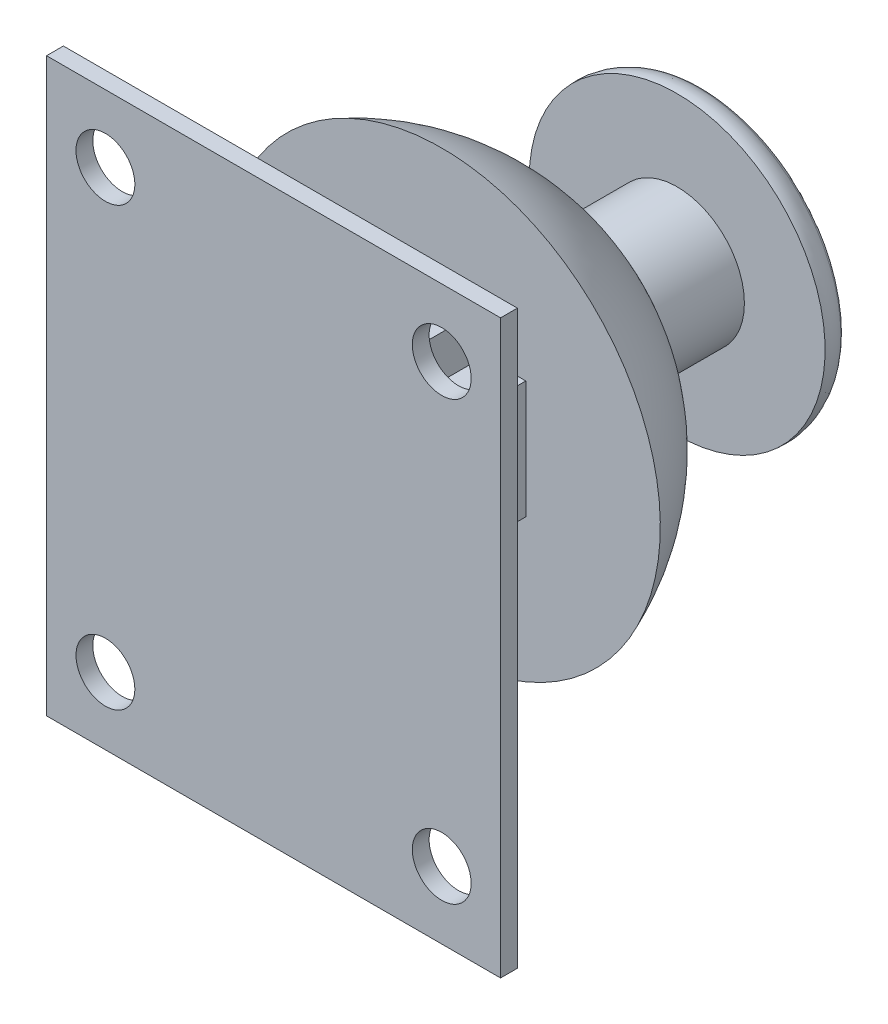
ISO-10303-21;
HEADER;
FILE_DESCRIPTION(('STEP AP214'),'2;1');
FILE_NAME('part.step','',(''),(''),'','','');
FILE_SCHEMA(('AUTOMOTIVE_DESIGN { 1 0 10303 214 1 1 1 1 }'));
ENDSEC;
DATA;
#1=APPLICATION_CONTEXT('core data for automotive mechanical design processes');
#2=APPLICATION_PROTOCOL_DEFINITION('international standard','automotive_design',2000,#1);
#3=PRODUCT_CONTEXT('',#1,'mechanical');
#4=PRODUCT('Part','Part','',(#3));
#5=PRODUCT_RELATED_PRODUCT_CATEGORY('part','',(#4));
#6=PRODUCT_DEFINITION_FORMATION('','',#4);
#7=PRODUCT_DEFINITION_CONTEXT('part definition',#1,'design');
#8=PRODUCT_DEFINITION('design','',#6,#7);
#9=PRODUCT_DEFINITION_SHAPE('','',#8);
#10=(LENGTH_UNIT() NAMED_UNIT(*) SI_UNIT(.MILLI.,.METRE.));
#11=(NAMED_UNIT(*) PLANE_ANGLE_UNIT() SI_UNIT($,.RADIAN.));
#12=(NAMED_UNIT(*) SI_UNIT($,.STERADIAN.) SOLID_ANGLE_UNIT());
#13=UNCERTAINTY_MEASURE_WITH_UNIT(LENGTH_MEASURE(1.E-05),#10,'distance_accuracy_value','');
#14=(GEOMETRIC_REPRESENTATION_CONTEXT(3) GLOBAL_UNCERTAINTY_ASSIGNED_CONTEXT((#13)) GLOBAL_UNIT_ASSIGNED_CONTEXT((#10,
#11,#12)) REPRESENTATION_CONTEXT('',''));
#15=CARTESIAN_POINT('',(0.,0.,0.));
#16=DIRECTION('',(0.,0.,1.));
#17=DIRECTION('',(1.,0.,0.));
#18=AXIS2_PLACEMENT_3D('',#15,#16,#17);
#19=CARTESIAN_POINT('',(0.,0.,1.));
#20=DIRECTION('',(0.,0.,1.));
#21=DIRECTION('',(1.,0.,0.));
#22=AXIS2_PLACEMENT_3D('',#19,#20,#21);
#23=PLANE('',#22);
#24=CARTESIAN_POINT('',(10.,-13.,1.));
#25=DIRECTION('',(0.,0.,1.));
#26=DIRECTION('',(-1.,0.,0.));
#27=AXIS2_PLACEMENT_3D('',#24,#25,#26);
#28=CIRCLE('',#27,1.75);
#29=CARTESIAN_POINT('',(8.25,-13.,1.));
#30=VERTEX_POINT('',#29);
#31=EDGE_CURVE('E361',#30,#30,#28,.T.);
#32=ORIENTED_EDGE('',*,*,#31,.F.);
#33=EDGE_LOOP('',(#32));
#34=FACE_BOUND('',#33,.T.);
#35=CARTESIAN_POINT('',(10.,13.,1.));
#36=DIRECTION('',(0.,0.,1.));
#37=DIRECTION('',(1.,0.,0.));
#38=AXIS2_PLACEMENT_3D('',#35,#36,#37);
#39=CIRCLE('',#38,1.75);
#40=CARTESIAN_POINT('',(11.75,13.,1.));
#41=VERTEX_POINT('',#40);
#42=EDGE_CURVE('E216',#41,#41,#39,.T.);
#43=ORIENTED_EDGE('',*,*,#42,.F.);
#44=EDGE_LOOP('',(#43));
#45=FACE_BOUND('',#44,.T.);
#46=DIRECTION('',(0.,1.,0.));
#47=VECTOR('',#46,1.);
#48=CARTESIAN_POINT('',(13.5,17.,1.));
#49=LINE('',#48,#47);
#50=CARTESIAN_POINT('',(13.5,-17.,1.));
#51=VERTEX_POINT('',#50);
#52=CARTESIAN_POINT('',(13.5,17.,1.));
#53=VERTEX_POINT('',#52);
#54=EDGE_CURVE('E228',#51,#53,#49,.T.);
#55=ORIENTED_EDGE('',*,*,#54,.T.);
#56=DIRECTION('',(-1.,0.,0.));
#57=VECTOR('',#56,1.);
#58=CARTESIAN_POINT('',(-13.5,17.,1.));
#59=LINE('',#58,#57);
#60=CARTESIAN_POINT('',(-13.5,17.,1.));
#61=VERTEX_POINT('',#60);
#62=EDGE_CURVE('E90',#53,#61,#59,.T.);
#63=ORIENTED_EDGE('',*,*,#62,.T.);
#64=DIRECTION('',(0.,-1.,0.));
#65=VECTOR('',#64,1.);
#66=CARTESIAN_POINT('',(-13.5,17.,1.));
#67=LINE('',#66,#65);
#68=CARTESIAN_POINT('',(-13.5,-17.,1.));
#69=VERTEX_POINT('',#68);
#70=EDGE_CURVE('E375',#61,#69,#67,.T.);
#71=ORIENTED_EDGE('',*,*,#70,.T.);
#72=DIRECTION('',(1.,0.,0.));
#73=VECTOR('',#72,1.);
#74=CARTESIAN_POINT('',(-13.5,-17.,1.));
#75=LINE('',#74,#73);
#76=EDGE_CURVE('E61',#69,#51,#75,.T.);
#77=ORIENTED_EDGE('',*,*,#76,.T.);
#78=EDGE_LOOP('',(#55,#63,#71,#77));
#79=FACE_BOUND('',#78,.T.);
#80=CARTESIAN_POINT('',(-10.,13.,1.));
#81=DIRECTION('',(0.,0.,1.));
#82=DIRECTION('',(-1.,0.,0.));
#83=AXIS2_PLACEMENT_3D('',#80,#81,#82);
#84=CIRCLE('',#83,1.75);
#85=CARTESIAN_POINT('',(-11.75,13.,1.));
#86=VERTEX_POINT('',#85);
#87=EDGE_CURVE('E367',#86,#86,#84,.T.);
#88=ORIENTED_EDGE('',*,*,#87,.F.);
#89=EDGE_LOOP('',(#88));
#90=FACE_BOUND('',#89,.T.);
#91=CARTESIAN_POINT('',(-10.,-13.,1.));
#92=DIRECTION('',(0.,0.,1.));
#93=DIRECTION('',(1.,0.,0.));
#94=AXIS2_PLACEMENT_3D('',#91,#92,#93);
#95=CIRCLE('',#94,1.75);
#96=CARTESIAN_POINT('',(-8.25,-13.,1.));
#97=VERTEX_POINT('',#96);
#98=EDGE_CURVE('E355',#97,#97,#95,.T.);
#99=ORIENTED_EDGE('',*,*,#98,.F.);
#100=EDGE_LOOP('',(#99));
#101=FACE_BOUND('',#100,.T.);
#102=ADVANCED_FACE('F37',(#34,#45,#79,#90,#101),#23,.T.);
#103=CARTESIAN_POINT('',(0.,0.,0.));
#104=DIRECTION('',(0.,0.,1.));
#105=DIRECTION('',(1.,0.,0.));
#106=AXIS2_PLACEMENT_3D('',#103,#104,#105);
#107=PLANE('',#106);
#108=DIRECTION('',(0.,1.,0.));
#109=VECTOR('',#108,1.);
#110=CARTESIAN_POINT('',(1.5,0.,0.));
#111=LINE('',#110,#109);
#112=CARTESIAN_POINT('',(1.5,-6.,0.));
#113=VERTEX_POINT('',#112);
#114=CARTESIAN_POINT('',(1.5,-3.5,0.));
#115=VERTEX_POINT('',#114);
#116=EDGE_CURVE('E299',#113,#115,#111,.T.);
#117=ORIENTED_EDGE('',*,*,#116,.T.);
#118=DIRECTION('',(1.,0.,0.));
#119=VECTOR('',#118,1.);
#120=CARTESIAN_POINT('',(0.,-3.5,0.));
#121=LINE('',#120,#119);
#122=CARTESIAN_POINT('',(4.,-3.5,0.));
#123=VERTEX_POINT('',#122);
#124=EDGE_CURVE('E52',#115,#123,#121,.T.);
#125=ORIENTED_EDGE('',*,*,#124,.T.);
#126=DIRECTION('',(0.,-1.,0.));
#127=VECTOR('',#126,1.);
#128=CARTESIAN_POINT('',(4.,0.,0.));
#129=LINE('',#128,#127);
#130=CARTESIAN_POINT('',(4.,3.5,0.));
#131=VERTEX_POINT('',#130);
#132=EDGE_CURVE('E264',#131,#123,#129,.T.);
#133=ORIENTED_EDGE('',*,*,#132,.F.);
#134=DIRECTION('',(1.,0.,0.));
#135=VECTOR('',#134,1.);
#136=CARTESIAN_POINT('',(0.,3.5,0.));
#137=LINE('',#136,#135);
#138=CARTESIAN_POINT('',(1.5,3.5,0.));
#139=VERTEX_POINT('',#138);
#140=EDGE_CURVE('E323',#139,#131,#137,.T.);
#141=ORIENTED_EDGE('',*,*,#140,.F.);
#142=DIRECTION('',(0.,-1.,0.));
#143=VECTOR('',#142,1.);
#144=CARTESIAN_POINT('',(1.5,0.,0.));
#145=LINE('',#144,#143);
#146=CARTESIAN_POINT('',(1.5,6.,0.));
#147=VERTEX_POINT('',#146);
#148=EDGE_CURVE('E321',#147,#139,#145,.T.);
#149=ORIENTED_EDGE('',*,*,#148,.F.);
#150=DIRECTION('',(1.,0.,0.));
#151=VECTOR('',#150,1.);
#152=CARTESIAN_POINT('',(0.,6.,0.));
#153=LINE('',#152,#151);
#154=CARTESIAN_POINT('',(-9.5,6.,0.));
#155=VERTEX_POINT('',#154);
#156=EDGE_CURVE('E319',#155,#147,#153,.T.);
#157=ORIENTED_EDGE('',*,*,#156,.F.);
#158=DIRECTION('',(0.,-1.,0.));
#159=VECTOR('',#158,1.);
#160=CARTESIAN_POINT('',(-9.5,0.,0.));
#161=LINE('',#160,#159);
#162=CARTESIAN_POINT('',(-9.5,3.5,0.));
#163=VERTEX_POINT('',#162);
#164=EDGE_CURVE('E316',#155,#163,#161,.T.);
#165=ORIENTED_EDGE('',*,*,#164,.T.);
#166=DIRECTION('',(-1.,0.,0.));
#167=VECTOR('',#166,1.);
#168=CARTESIAN_POINT('',(0.,3.5,0.));
#169=LINE('',#168,#167);
#170=CARTESIAN_POINT('',(-12.,3.5,0.));
#171=VERTEX_POINT('',#170);
#172=EDGE_CURVE('E313',#163,#171,#169,.T.);
#173=ORIENTED_EDGE('',*,*,#172,.T.);
#174=DIRECTION('',(0.,-1.,0.));
#175=VECTOR('',#174,1.);
#176=CARTESIAN_POINT('',(-12.,0.,0.));
#177=LINE('',#176,#175);
#178=CARTESIAN_POINT('',(-12.,-3.5,0.));
#179=VERTEX_POINT('',#178);
#180=EDGE_CURVE('E310',#171,#179,#177,.T.);
#181=ORIENTED_EDGE('',*,*,#180,.T.);
#182=DIRECTION('',(-1.,0.,0.));
#183=VECTOR('',#182,1.);
#184=CARTESIAN_POINT('',(0.,-3.5,0.));
#185=LINE('',#184,#183);
#186=CARTESIAN_POINT('',(-9.5,-3.5,0.));
#187=VERTEX_POINT('',#186);
#188=EDGE_CURVE('E307',#187,#179,#185,.T.);
#189=ORIENTED_EDGE('',*,*,#188,.F.);
#190=DIRECTION('',(0.,1.,0.));
#191=VECTOR('',#190,1.);
#192=CARTESIAN_POINT('',(-9.5,0.,0.));
#193=LINE('',#192,#191);
#194=CARTESIAN_POINT('',(-9.5,-6.,0.));
#195=VERTEX_POINT('',#194);
#196=EDGE_CURVE('E305',#195,#187,#193,.T.);
#197=ORIENTED_EDGE('',*,*,#196,.F.);
#198=DIRECTION('',(1.,0.,0.));
#199=VECTOR('',#198,1.);
#200=CARTESIAN_POINT('',(0.,-6.,0.));
#201=LINE('',#200,#199);
#202=EDGE_CURVE('E302',#195,#113,#201,.T.);
#203=ORIENTED_EDGE('',*,*,#202,.T.);
#204=EDGE_LOOP('',(#117,#125,#133,#141,#149,#157,#165,#173,#181,#189,#197,#203));
#205=FACE_BOUND('',#204,.T.);
#206=DIRECTION('',(0.,1.,0.));
#207=VECTOR('',#206,1.);
#208=CARTESIAN_POINT('',(13.5,17.,0.));
#209=LINE('',#208,#207);
#210=CARTESIAN_POINT('',(13.5,-17.,0.));
#211=VERTEX_POINT('',#210);
#212=CARTESIAN_POINT('',(13.5,17.,0.));
#213=VERTEX_POINT('',#212);
#214=EDGE_CURVE('E210',#211,#213,#209,.T.);
#215=ORIENTED_EDGE('',*,*,#214,.F.);
#216=DIRECTION('',(1.,0.,0.));
#217=VECTOR('',#216,1.);
#218=CARTESIAN_POINT('',(-13.5,-17.,0.));
#219=LINE('',#218,#217);
#220=CARTESIAN_POINT('',(-13.5,-17.,0.));
#221=VERTEX_POINT('',#220);
#222=EDGE_CURVE('E82',#221,#211,#219,.T.);
#223=ORIENTED_EDGE('',*,*,#222,.F.);
#224=DIRECTION('',(0.,-1.,0.));
#225=VECTOR('',#224,1.);
#226=CARTESIAN_POINT('',(-13.5,17.,0.));
#227=LINE('',#226,#225);
#228=CARTESIAN_POINT('',(-13.5,17.,0.));
#229=VERTEX_POINT('',#228);
#230=EDGE_CURVE('E218',#229,#221,#227,.T.);
#231=ORIENTED_EDGE('',*,*,#230,.F.);
#232=DIRECTION('',(-1.,0.,0.));
#233=VECTOR('',#232,1.);
#234=CARTESIAN_POINT('',(-13.5,17.,0.));
#235=LINE('',#234,#233);
#236=EDGE_CURVE('E215',#213,#229,#235,.T.);
#237=ORIENTED_EDGE('',*,*,#236,.F.);
#238=EDGE_LOOP('',(#215,#223,#231,#237));
#239=FACE_BOUND('',#238,.T.);
#240=CARTESIAN_POINT('',(10.,13.,0.));
#241=DIRECTION('',(0.,0.,1.));
#242=DIRECTION('',(1.,0.,0.));
#243=AXIS2_PLACEMENT_3D('',#240,#241,#242);
#244=CIRCLE('',#243,1.75);
#245=CARTESIAN_POINT('',(11.75,13.,0.));
#246=VERTEX_POINT('',#245);
#247=EDGE_CURVE('E221',#246,#246,#244,.T.);
#248=ORIENTED_EDGE('',*,*,#247,.T.);
#249=EDGE_LOOP('',(#248));
#250=FACE_BOUND('',#249,.T.);
#251=CARTESIAN_POINT('',(-10.,13.,0.));
#252=DIRECTION('',(0.,0.,1.));
#253=DIRECTION('',(-1.,0.,0.));
#254=AXIS2_PLACEMENT_3D('',#251,#252,#253);
#255=CIRCLE('',#254,1.75);
#256=CARTESIAN_POINT('',(-11.75,13.,0.));
#257=VERTEX_POINT('',#256);
#258=EDGE_CURVE('E364',#257,#257,#255,.T.);
#259=ORIENTED_EDGE('',*,*,#258,.T.);
#260=EDGE_LOOP('',(#259));
#261=FACE_BOUND('',#260,.T.);
#262=CARTESIAN_POINT('',(10.,-13.,0.));
#263=DIRECTION('',(0.,0.,1.));
#264=DIRECTION('',(-1.,0.,0.));
#265=AXIS2_PLACEMENT_3D('',#262,#263,#264);
#266=CIRCLE('',#265,1.75);
#267=CARTESIAN_POINT('',(8.25,-13.,0.));
#268=VERTEX_POINT('',#267);
#269=EDGE_CURVE('E358',#268,#268,#266,.T.);
#270=ORIENTED_EDGE('',*,*,#269,.T.);
#271=EDGE_LOOP('',(#270));
#272=FACE_BOUND('',#271,.T.);
#273=CARTESIAN_POINT('',(-10.,-13.,0.));
#274=DIRECTION('',(0.,0.,1.));
#275=DIRECTION('',(1.,0.,0.));
#276=AXIS2_PLACEMENT_3D('',#273,#274,#275);
#277=CIRCLE('',#276,1.75);
#278=CARTESIAN_POINT('',(-8.25,-13.,0.));
#279=VERTEX_POINT('',#278);
#280=EDGE_CURVE('E354',#279,#279,#277,.T.);
#281=ORIENTED_EDGE('',*,*,#280,.T.);
#282=EDGE_LOOP('',(#281));
#283=FACE_BOUND('',#282,.T.);
#284=ADVANCED_FACE('F179',(#205,#239,#250,#261,#272,#283),#107,.F.);
#285=CARTESIAN_POINT('',(13.5,17.,1.));
#286=DIRECTION('',(-1.,0.,0.));
#287=DIRECTION('',(0.,0.,1.));
#288=AXIS2_PLACEMENT_3D('',#285,#286,#287);
#289=PLANE('',#288);
#290=ORIENTED_EDGE('',*,*,#214,.T.);
#291=DIRECTION('',(0.,0.,-1.));
#292=VECTOR('',#291,1.);
#293=CARTESIAN_POINT('',(13.5,17.,1.));
#294=LINE('',#293,#292);
#295=EDGE_CURVE('E212',#53,#213,#294,.T.);
#296=ORIENTED_EDGE('',*,*,#295,.F.);
#297=ORIENTED_EDGE('',*,*,#54,.F.);
#298=DIRECTION('',(0.,0.,-1.));
#299=VECTOR('',#298,1.);
#300=CARTESIAN_POINT('',(13.5,-17.,1.));
#301=LINE('',#300,#299);
#302=EDGE_CURVE('E213',#51,#211,#301,.T.);
#303=ORIENTED_EDGE('',*,*,#302,.T.);
#304=EDGE_LOOP('',(#290,#296,#297,#303));
#305=FACE_BOUND('',#304,.T.);
#306=ADVANCED_FACE('F185',(#305),#289,.F.);
#307=CARTESIAN_POINT('',(-13.5,17.,1.));
#308=DIRECTION('',(0.,-1.,0.));
#309=DIRECTION('',(0.,0.,-1.));
#310=AXIS2_PLACEMENT_3D('',#307,#308,#309);
#311=PLANE('',#310);
#312=ORIENTED_EDGE('',*,*,#236,.T.);
#313=DIRECTION('',(0.,0.,-1.));
#314=VECTOR('',#313,1.);
#315=CARTESIAN_POINT('',(-13.5,17.,1.));
#316=LINE('',#315,#314);
#317=EDGE_CURVE('E232',#61,#229,#316,.T.);
#318=ORIENTED_EDGE('',*,*,#317,.F.);
#319=ORIENTED_EDGE('',*,*,#62,.F.);
#320=ORIENTED_EDGE('',*,*,#295,.T.);
#321=EDGE_LOOP('',(#312,#318,#319,#320));
#322=FACE_BOUND('',#321,.T.);
#323=ADVANCED_FACE('F200',(#322),#311,.F.);
#324=CARTESIAN_POINT('',(-13.5,17.,1.));
#325=DIRECTION('',(1.,0.,0.));
#326=DIRECTION('',(0.,0.,-1.));
#327=AXIS2_PLACEMENT_3D('',#324,#325,#326);
#328=PLANE('',#327);
#329=ORIENTED_EDGE('',*,*,#230,.T.);
#330=DIRECTION('',(0.,0.,-1.));
#331=VECTOR('',#330,1.);
#332=CARTESIAN_POINT('',(-13.5,-17.,1.));
#333=LINE('',#332,#331);
#334=EDGE_CURVE('E230',#69,#221,#333,.T.);
#335=ORIENTED_EDGE('',*,*,#334,.F.);
#336=ORIENTED_EDGE('',*,*,#70,.F.);
#337=ORIENTED_EDGE('',*,*,#317,.T.);
#338=EDGE_LOOP('',(#329,#335,#336,#337));
#339=FACE_BOUND('',#338,.T.);
#340=ADVANCED_FACE('F197',(#339),#328,.F.);
#341=CARTESIAN_POINT('',(-13.5,-17.,1.));
#342=DIRECTION('',(0.,1.,0.));
#343=DIRECTION('',(0.,0.,1.));
#344=AXIS2_PLACEMENT_3D('',#341,#342,#343);
#345=PLANE('',#344);
#346=ORIENTED_EDGE('',*,*,#222,.T.);
#347=ORIENTED_EDGE('',*,*,#302,.F.);
#348=ORIENTED_EDGE('',*,*,#76,.F.);
#349=ORIENTED_EDGE('',*,*,#334,.T.);
#350=EDGE_LOOP('',(#346,#347,#348,#349));
#351=FACE_BOUND('',#350,.T.);
#352=ADVANCED_FACE('F194',(#351),#345,.F.);
#353=CARTESIAN_POINT('',(10.,13.,1.));
#354=DIRECTION('',(0.,0.,-1.));
#355=DIRECTION('',(-1.,0.,0.));
#356=AXIS2_PLACEMENT_3D('',#353,#354,#355);
#357=CYLINDRICAL_SURFACE('',#356,1.75);
#358=ORIENTED_EDGE('',*,*,#42,.T.);
#359=EDGE_LOOP('',(#358));
#360=FACE_BOUND('',#359,.T.);
#361=ORIENTED_EDGE('',*,*,#247,.F.);
#362=EDGE_LOOP('',(#361));
#363=FACE_BOUND('',#362,.T.);
#364=ADVANCED_FACE('F191',(#360,#363),#357,.F.);
#365=CARTESIAN_POINT('',(-10.,13.,1.));
#366=DIRECTION('',(0.,0.,-1.));
#367=DIRECTION('',(-1.,0.,0.));
#368=AXIS2_PLACEMENT_3D('',#365,#366,#367);
#369=CYLINDRICAL_SURFACE('',#368,1.75);
#370=ORIENTED_EDGE('',*,*,#87,.T.);
#371=EDGE_LOOP('',(#370));
#372=FACE_BOUND('',#371,.T.);
#373=ORIENTED_EDGE('',*,*,#258,.F.);
#374=EDGE_LOOP('',(#373));
#375=FACE_BOUND('',#374,.T.);
#376=ADVANCED_FACE('F401',(#372,#375),#369,.F.);
#377=CARTESIAN_POINT('',(10.,-13.,1.));
#378=DIRECTION('',(0.,0.,-1.));
#379=DIRECTION('',(-1.,0.,0.));
#380=AXIS2_PLACEMENT_3D('',#377,#378,#379);
#381=CYLINDRICAL_SURFACE('',#380,1.75);
#382=ORIENTED_EDGE('',*,*,#31,.T.);
#383=EDGE_LOOP('',(#382));
#384=FACE_BOUND('',#383,.T.);
#385=ORIENTED_EDGE('',*,*,#269,.F.);
#386=EDGE_LOOP('',(#385));
#387=FACE_BOUND('',#386,.T.);
#388=ADVANCED_FACE('F392',(#384,#387),#381,.F.);
#389=CARTESIAN_POINT('',(-10.,-13.,1.));
#390=DIRECTION('',(0.,0.,-1.));
#391=DIRECTION('',(-1.,0.,0.));
#392=AXIS2_PLACEMENT_3D('',#389,#390,#391);
#393=CYLINDRICAL_SURFACE('',#392,1.75);
#394=ORIENTED_EDGE('',*,*,#98,.T.);
#395=EDGE_LOOP('',(#394));
#396=FACE_BOUND('',#395,.T.);
#397=ORIENTED_EDGE('',*,*,#280,.F.);
#398=EDGE_LOOP('',(#397));
#399=FACE_BOUND('',#398,.T.);
#400=ADVANCED_FACE('F389',(#396,#399),#393,.F.);
#401=CARTESIAN_POINT('',(0.,-3.5,-10.));
#402=DIRECTION('',(0.,-1.,0.));
#403=DIRECTION('',(0.,0.,-1.));
#404=AXIS2_PLACEMENT_3D('',#401,#402,#403);
#405=PLANE('',#404);
#406=ORIENTED_EDGE('',*,*,#124,.F.);
#407=DIRECTION('',(0.,0.,1.));
#408=VECTOR('',#407,1.);
#409=CARTESIAN_POINT('',(1.5,-3.5,-10.));
#410=LINE('',#409,#408);
#411=CARTESIAN_POINT('',(1.5,-3.5,-10.));
#412=VERTEX_POINT('',#411);
#413=EDGE_CURVE('E352',#412,#115,#410,.T.);
#414=ORIENTED_EDGE('',*,*,#413,.F.);
#415=DIRECTION('',(1.,0.,0.));
#416=VECTOR('',#415,1.);
#417=CARTESIAN_POINT('',(0.,-3.5,-10.));
#418=LINE('',#417,#416);
#419=CARTESIAN_POINT('',(4.,-3.5,-10.));
#420=VERTEX_POINT('',#419);
#421=EDGE_CURVE('E261',#412,#420,#418,.T.);
#422=ORIENTED_EDGE('',*,*,#421,.T.);
#423=DIRECTION('',(0.,0.,1.));
#424=VECTOR('',#423,1.);
#425=CARTESIAN_POINT('',(4.,-3.5,-10.));
#426=LINE('',#425,#424);
#427=EDGE_CURVE('E297',#420,#123,#426,.T.);
#428=ORIENTED_EDGE('',*,*,#427,.T.);
#429=EDGE_LOOP('',(#406,#414,#422,#428));
#430=FACE_BOUND('',#429,.T.);
#431=ADVANCED_FACE('F391',(#430),#405,.T.);
#432=CARTESIAN_POINT('',(1.5,0.,-10.));
#433=DIRECTION('',(1.,0.,0.));
#434=DIRECTION('',(0.,1.,0.));
#435=AXIS2_PLACEMENT_3D('',#432,#433,#434);
#436=PLANE('',#435);
#437=ORIENTED_EDGE('',*,*,#116,.F.);
#438=DIRECTION('',(0.,0.,1.));
#439=VECTOR('',#438,1.);
#440=CARTESIAN_POINT('',(1.5,-6.,-10.));
#441=LINE('',#440,#439);
#442=CARTESIAN_POINT('',(1.5,-6.,-10.));
#443=VERTEX_POINT('',#442);
#444=EDGE_CURVE('E350',#443,#113,#441,.T.);
#445=ORIENTED_EDGE('',*,*,#444,.F.);
#446=DIRECTION('',(0.,1.,0.));
#447=VECTOR('',#446,1.);
#448=CARTESIAN_POINT('',(1.5,0.,-10.));
#449=LINE('',#448,#447);
#450=EDGE_CURVE('E263',#443,#412,#449,.T.);
#451=ORIENTED_EDGE('',*,*,#450,.T.);
#452=ORIENTED_EDGE('',*,*,#413,.T.);
#453=EDGE_LOOP('',(#437,#445,#451,#452));
#454=FACE_BOUND('',#453,.T.);
#455=ADVANCED_FACE('F399',(#454),#436,.T.);
#456=CARTESIAN_POINT('',(0.,-6.,-10.));
#457=DIRECTION('',(0.,-1.,0.));
#458=DIRECTION('',(1.,0.,0.));
#459=AXIS2_PLACEMENT_3D('',#456,#457,#458);
#460=PLANE('',#459);
#461=ORIENTED_EDGE('',*,*,#202,.F.);
#462=DIRECTION('',(0.,0.,1.));
#463=VECTOR('',#462,1.);
#464=CARTESIAN_POINT('',(-9.5,-6.,-10.));
#465=LINE('',#464,#463);
#466=CARTESIAN_POINT('',(-9.5,-6.,-10.));
#467=VERTEX_POINT('',#466);
#468=EDGE_CURVE('E348',#467,#195,#465,.T.);
#469=ORIENTED_EDGE('',*,*,#468,.F.);
#470=DIRECTION('',(1.,0.,0.));
#471=VECTOR('',#470,1.);
#472=CARTESIAN_POINT('',(0.,-6.,-10.));
#473=LINE('',#472,#471);
#474=EDGE_CURVE('E267',#467,#443,#473,.T.);
#475=ORIENTED_EDGE('',*,*,#474,.T.);
#476=ORIENTED_EDGE('',*,*,#444,.T.);
#477=EDGE_LOOP('',(#461,#469,#475,#476));
#478=FACE_BOUND('',#477,.T.);
#479=ADVANCED_FACE('F463',(#478),#460,.T.);
#480=CARTESIAN_POINT('',(-9.5,0.,-10.));
#481=DIRECTION('',(1.,0.,0.));
#482=DIRECTION('',(0.,0.,-1.));
#483=AXIS2_PLACEMENT_3D('',#480,#481,#482);
#484=PLANE('',#483);
#485=ORIENTED_EDGE('',*,*,#196,.T.);
#486=DIRECTION('',(0.,0.,1.));
#487=VECTOR('',#486,1.);
#488=CARTESIAN_POINT('',(-9.5,-3.5,-10.));
#489=LINE('',#488,#487);
#490=CARTESIAN_POINT('',(-9.5,-3.5,-10.));
#491=VERTEX_POINT('',#490);
#492=EDGE_CURVE('E345',#491,#187,#489,.T.);
#493=ORIENTED_EDGE('',*,*,#492,.F.);
#494=DIRECTION('',(0.,1.,0.));
#495=VECTOR('',#494,1.);
#496=CARTESIAN_POINT('',(-9.5,0.,-10.));
#497=LINE('',#496,#495);
#498=EDGE_CURVE('E270',#467,#491,#497,.T.);
#499=ORIENTED_EDGE('',*,*,#498,.F.);
#500=ORIENTED_EDGE('',*,*,#468,.T.);
#501=EDGE_LOOP('',(#485,#493,#499,#500));
#502=FACE_BOUND('',#501,.T.);
#503=ADVANCED_FACE('F472',(#502),#484,.F.);
#504=CARTESIAN_POINT('',(0.,-3.5,-10.));
#505=DIRECTION('',(0.,1.,0.));
#506=DIRECTION('',(-1.,0.,0.));
#507=AXIS2_PLACEMENT_3D('',#504,#505,#506);
#508=PLANE('',#507);
#509=ORIENTED_EDGE('',*,*,#188,.T.);
#510=DIRECTION('',(0.,0.,1.));
#511=VECTOR('',#510,1.);
#512=CARTESIAN_POINT('',(-12.,-3.5,-10.));
#513=LINE('',#512,#511);
#514=CARTESIAN_POINT('',(-12.,-3.5,-10.));
#515=VERTEX_POINT('',#514);
#516=EDGE_CURVE('E343',#515,#179,#513,.T.);
#517=ORIENTED_EDGE('',*,*,#516,.F.);
#518=DIRECTION('',(-1.,0.,0.));
#519=VECTOR('',#518,1.);
#520=CARTESIAN_POINT('',(0.,-3.5,-10.));
#521=LINE('',#520,#519);
#522=EDGE_CURVE('E273',#491,#515,#521,.T.);
#523=ORIENTED_EDGE('',*,*,#522,.F.);
#524=ORIENTED_EDGE('',*,*,#492,.T.);
#525=EDGE_LOOP('',(#509,#517,#523,#524));
#526=FACE_BOUND('',#525,.T.);
#527=ADVANCED_FACE('F482',(#526),#508,.F.);
#528=CARTESIAN_POINT('',(-12.,0.,-10.));
#529=DIRECTION('',(-1.,0.,0.));
#530=DIRECTION('',(0.,0.,1.));
#531=AXIS2_PLACEMENT_3D('',#528,#529,#530);
#532=PLANE('',#531);
#533=ORIENTED_EDGE('',*,*,#180,.F.);
#534=DIRECTION('',(0.,0.,1.));
#535=VECTOR('',#534,1.);
#536=CARTESIAN_POINT('',(-12.,3.5,-10.));
#537=LINE('',#536,#535);
#538=CARTESIAN_POINT('',(-12.,3.5,-10.));
#539=VERTEX_POINT('',#538);
#540=EDGE_CURVE('E341',#539,#171,#537,.T.);
#541=ORIENTED_EDGE('',*,*,#540,.F.);
#542=DIRECTION('',(0.,-1.,0.));
#543=VECTOR('',#542,1.);
#544=CARTESIAN_POINT('',(-12.,0.,-10.));
#545=LINE('',#544,#543);
#546=EDGE_CURVE('E276',#539,#515,#545,.T.);
#547=ORIENTED_EDGE('',*,*,#546,.T.);
#548=ORIENTED_EDGE('',*,*,#516,.T.);
#549=EDGE_LOOP('',(#533,#541,#547,#548));
#550=FACE_BOUND('',#549,.T.);
#551=ADVANCED_FACE('F492',(#550),#532,.T.);
#552=CARTESIAN_POINT('',(0.,3.5,-10.));
#553=DIRECTION('',(0.,1.,0.));
#554=DIRECTION('',(-1.,0.,0.));
#555=AXIS2_PLACEMENT_3D('',#552,#553,#554);
#556=PLANE('',#555);
#557=ORIENTED_EDGE('',*,*,#172,.F.);
#558=DIRECTION('',(0.,0.,1.));
#559=VECTOR('',#558,1.);
#560=CARTESIAN_POINT('',(-9.5,3.5,-10.));
#561=LINE('',#560,#559);
#562=CARTESIAN_POINT('',(-9.5,3.5,-10.));
#563=VERTEX_POINT('',#562);
#564=EDGE_CURVE('E339',#563,#163,#561,.T.);
#565=ORIENTED_EDGE('',*,*,#564,.F.);
#566=DIRECTION('',(-1.,0.,0.));
#567=VECTOR('',#566,1.);
#568=CARTESIAN_POINT('',(0.,3.5,-10.));
#569=LINE('',#568,#567);
#570=EDGE_CURVE('E279',#563,#539,#569,.T.);
#571=ORIENTED_EDGE('',*,*,#570,.T.);
#572=ORIENTED_EDGE('',*,*,#540,.T.);
#573=EDGE_LOOP('',(#557,#565,#571,#572));
#574=FACE_BOUND('',#573,.T.);
#575=ADVANCED_FACE('F503',(#574),#556,.T.);
#576=CARTESIAN_POINT('',(-9.5,0.,-10.));
#577=DIRECTION('',(-1.,0.,0.));
#578=DIRECTION('',(0.,0.,1.));
#579=AXIS2_PLACEMENT_3D('',#576,#577,#578);
#580=PLANE('',#579);
#581=ORIENTED_EDGE('',*,*,#164,.F.);
#582=DIRECTION('',(0.,0.,1.));
#583=VECTOR('',#582,1.);
#584=CARTESIAN_POINT('',(-9.5,6.,-10.));
#585=LINE('',#584,#583);
#586=CARTESIAN_POINT('',(-9.5,6.,-10.));
#587=VERTEX_POINT('',#586);
#588=EDGE_CURVE('E337',#587,#155,#585,.T.);
#589=ORIENTED_EDGE('',*,*,#588,.F.);
#590=DIRECTION('',(0.,-1.,0.));
#591=VECTOR('',#590,1.);
#592=CARTESIAN_POINT('',(-9.5,0.,-10.));
#593=LINE('',#592,#591);
#594=EDGE_CURVE('E282',#587,#563,#593,.T.);
#595=ORIENTED_EDGE('',*,*,#594,.T.);
#596=ORIENTED_EDGE('',*,*,#564,.T.);
#597=EDGE_LOOP('',(#581,#589,#595,#596));
#598=FACE_BOUND('',#597,.T.);
#599=ADVANCED_FACE('F513',(#598),#580,.T.);
#600=CARTESIAN_POINT('',(0.,6.,-10.));
#601=DIRECTION('',(0.,-1.,0.));
#602=DIRECTION('',(1.,0.,0.));
#603=AXIS2_PLACEMENT_3D('',#600,#601,#602);
#604=PLANE('',#603);
#605=ORIENTED_EDGE('',*,*,#156,.T.);
#606=DIRECTION('',(0.,0.,1.));
#607=VECTOR('',#606,1.);
#608=CARTESIAN_POINT('',(1.5,6.,-10.));
#609=LINE('',#608,#607);
#610=CARTESIAN_POINT('',(1.5,6.,-10.));
#611=VERTEX_POINT('',#610);
#612=EDGE_CURVE('E334',#611,#147,#609,.T.);
#613=ORIENTED_EDGE('',*,*,#612,.F.);
#614=DIRECTION('',(1.,0.,0.));
#615=VECTOR('',#614,1.);
#616=CARTESIAN_POINT('',(0.,6.,-10.));
#617=LINE('',#616,#615);
#618=EDGE_CURVE('E285',#587,#611,#617,.T.);
#619=ORIENTED_EDGE('',*,*,#618,.F.);
#620=ORIENTED_EDGE('',*,*,#588,.T.);
#621=EDGE_LOOP('',(#605,#613,#619,#620));
#622=FACE_BOUND('',#621,.T.);
#623=ADVANCED_FACE('F523',(#622),#604,.F.);
#624=CARTESIAN_POINT('',(1.5,0.,-10.));
#625=DIRECTION('',(-1.,0.,0.));
#626=DIRECTION('',(0.,-1.,0.));
#627=AXIS2_PLACEMENT_3D('',#624,#625,#626);
#628=PLANE('',#627);
#629=ORIENTED_EDGE('',*,*,#148,.T.);
#630=DIRECTION('',(0.,0.,1.));
#631=VECTOR('',#630,1.);
#632=CARTESIAN_POINT('',(1.5,3.5,-10.));
#633=LINE('',#632,#631);
#634=CARTESIAN_POINT('',(1.5,3.5,-10.));
#635=VERTEX_POINT('',#634);
#636=EDGE_CURVE('E331',#635,#139,#633,.T.);
#637=ORIENTED_EDGE('',*,*,#636,.F.);
#638=DIRECTION('',(0.,-1.,0.));
#639=VECTOR('',#638,1.);
#640=CARTESIAN_POINT('',(1.5,0.,-10.));
#641=LINE('',#640,#639);
#642=EDGE_CURVE('E288',#611,#635,#641,.T.);
#643=ORIENTED_EDGE('',*,*,#642,.F.);
#644=ORIENTED_EDGE('',*,*,#612,.T.);
#645=EDGE_LOOP('',(#629,#637,#643,#644));
#646=FACE_BOUND('',#645,.T.);
#647=ADVANCED_FACE('F533',(#646),#628,.F.);
#648=CARTESIAN_POINT('',(0.,3.5,-10.));
#649=DIRECTION('',(0.,-1.,0.));
#650=DIRECTION('',(0.,0.,-1.));
#651=AXIS2_PLACEMENT_3D('',#648,#649,#650);
#652=PLANE('',#651);
#653=ORIENTED_EDGE('',*,*,#140,.T.);
#654=DIRECTION('',(0.,0.,1.));
#655=VECTOR('',#654,1.);
#656=CARTESIAN_POINT('',(4.,3.5,-10.));
#657=LINE('',#656,#655);
#658=CARTESIAN_POINT('',(4.,3.5,-10.));
#659=VERTEX_POINT('',#658);
#660=EDGE_CURVE('E328',#659,#131,#657,.T.);
#661=ORIENTED_EDGE('',*,*,#660,.F.);
#662=DIRECTION('',(1.,0.,0.));
#663=VECTOR('',#662,1.);
#664=CARTESIAN_POINT('',(0.,3.5,-10.));
#665=LINE('',#664,#663);
#666=EDGE_CURVE('E291',#635,#659,#665,.T.);
#667=ORIENTED_EDGE('',*,*,#666,.F.);
#668=ORIENTED_EDGE('',*,*,#636,.T.);
#669=EDGE_LOOP('',(#653,#661,#667,#668));
#670=FACE_BOUND('',#669,.T.);
#671=ADVANCED_FACE('F543',(#670),#652,.F.);
#672=CARTESIAN_POINT('',(4.,0.,-10.));
#673=DIRECTION('',(-1.,0.,0.));
#674=DIRECTION('',(0.,0.,1.));
#675=AXIS2_PLACEMENT_3D('',#672,#673,#674);
#676=PLANE('',#675);
#677=ORIENTED_EDGE('',*,*,#132,.T.);
#678=ORIENTED_EDGE('',*,*,#427,.F.);
#679=DIRECTION('',(0.,-1.,0.));
#680=VECTOR('',#679,1.);
#681=CARTESIAN_POINT('',(4.,0.,-10.));
#682=LINE('',#681,#680);
#683=EDGE_CURVE('E294',#659,#420,#682,.T.);
#684=ORIENTED_EDGE('',*,*,#683,.F.);
#685=ORIENTED_EDGE('',*,*,#660,.T.);
#686=EDGE_LOOP('',(#677,#678,#684,#685));
#687=FACE_BOUND('',#686,.T.);
#688=ADVANCED_FACE('F553',(#687),#676,.F.);
#689=CARTESIAN_POINT('',(-1.,0.,-4.80384757729337));
#690=DIRECTION('',(0.,0.,-1.));
#691=DIRECTION('',(0.,-1.,0.));
#692=AXIS2_PLACEMENT_3D('',#689,#690,#691);
#693=SPHERICAL_SURFACE('',#692,14.);
#694=CARTESIAN_POINT('',(-1.,0.,-18.2202554422921));
#695=DIRECTION('',(0.,0.,1.));
#696=DIRECTION('',(1.,0.,0.));
#697=AXIS2_PLACEMENT_3D('',#694,#695,#696);
#698=CIRCLE('',#697,4.);
#699=CARTESIAN_POINT('',(-1.,-3.99999999999999,-18.2202554422921));
#700=VERTEX_POINT('',#699);
#701=EDGE_CURVE('E236',#700,#700,#698,.T.);
#702=CARTESIAN_POINT('',(-1.,0.,-10.));
#703=DIRECTION('',(0.,0.,-1.));
#704=DIRECTION('',(-1.,0.,0.));
#705=AXIS2_PLACEMENT_3D('',#702,#703,#704);
#706=CIRCLE('',#705,13.);
#707=CARTESIAN_POINT('',(-1.,-13.,-10.));
#708=VERTEX_POINT('',#707);
#709=EDGE_CURVE('E238',#708,#708,#706,.T.);
#710=CARTESIAN_POINT('',(-1.,-3.99999999999999,-18.2202554422921));
#711=CARTESIAN_POINT('',(-1.,-4.12588987138682,-18.1827228831028));
#712=CARTESIAN_POINT('',(-1.,-4.25125114908435,-18.1434174565567));
#713=CARTESIAN_POINT('',(-1.,-4.50081790828749,-18.0612942076875));
#714=CARTESIAN_POINT('',(-1.,-4.6250233897931,-18.0184763853643));
#715=CARTESIAN_POINT('',(-1.,-4.87217994779904,-17.929361683877));
#716=CARTESIAN_POINT('',(-1.,-4.99513102429938,-17.8830648047129));
#717=CARTESIAN_POINT('',(-1.,-5.23968140280928,-17.7870288308637));
#718=CARTESIAN_POINT('',(-1.,-5.36128070481883,-17.7372897361787));
#719=CARTESIAN_POINT('',(-1.,-5.60303117019991,-17.6344087002609));
#720=CARTESIAN_POINT('',(-1.,-5.72318233357145,-17.5812667590281));
#721=CARTESIAN_POINT('',(-1.,-5.96194132259251,-17.4716221488032));
#722=CARTESIAN_POINT('',(-1.,-6.08054914824205,-17.4151194798111));
#723=CARTESIAN_POINT('',(-1.,-6.31612748089128,-17.2987981814113));
#724=CARTESIAN_POINT('',(-1.,-6.43309798789098,-17.2389795520036));
#725=CARTESIAN_POINT('',(-1.,-6.66530900092113,-17.1160737313903));
#726=CARTESIAN_POINT('',(-1.,-6.78054950695158,-17.0529865401846));
#727=CARTESIAN_POINT('',(-1.,-7.00920920616605,-16.9235935834358));
#728=CARTESIAN_POINT('',(-1.,-7.12262839935006,-16.8572878178928));
#729=CARTESIAN_POINT('',(-1.,-7.34755560421814,-16.7215102504708));
#730=CARTESIAN_POINT('',(-1.,-7.45906361590222,-16.6520384485919));
#731=CARTESIAN_POINT('',(-1.,-7.68008010343369,-16.5099838550622));
#732=CARTESIAN_POINT('',(-1.,-7.78958857928109,-16.4374010634113));
#733=CARTESIAN_POINT('',(-1.,-8.0065192251584,-16.2891820019406));
#734=CARTESIAN_POINT('',(-1.,-8.11394139518831,-16.2135457321208));
#735=CARTESIAN_POINT('',(-1.,-8.32661431255044,-16.0592796453598));
#736=CARTESIAN_POINT('',(-1.,-8.43186505988266,-15.9806498284185));
#737=CARTESIAN_POINT('',(-1.,-8.64011173551511,-15.8204589504262));
#738=CARTESIAN_POINT('',(-1.,-8.74310766381534,-15.7388978893751));
#739=CARTESIAN_POINT('',(-1.,-8.94676309167462,-15.5729091487709));
#740=CARTESIAN_POINT('',(-1.,-9.04742259123368,-15.4884814692178));
#741=CARTESIAN_POINT('',(-1.,-9.24632540319086,-15.3168263886072));
#742=CARTESIAN_POINT('',(-1.,-9.34456871558899,-15.2295989875497));
#743=CARTESIAN_POINT('',(-1.,-9.53856130929123,-15.0524135793113));
#744=CARTESIAN_POINT('',(-1.,-9.63431059059534,-14.9624555721305));
#745=CARTESIAN_POINT('',(-1.,-9.82323925434342,-14.7798802306457));
#746=CARTESIAN_POINT('',(-1.,-9.91641863678741,-14.6872628963418));
#747=CARTESIAN_POINT('',(-1.,-10.1001336713306,-14.4994422867519));
#748=CARTESIAN_POINT('',(-1.,-10.1906693234297,-14.4042390114659));
#749=CARTESIAN_POINT('',(-1.,-10.3690251605811,-14.2113219550454));
#750=CARTESIAN_POINT('',(-1.,-10.4568453456334,-14.113608173911));
#751=CARTESIAN_POINT('',(-1.,-10.6297006636121,-13.9157475301478));
#752=CARTESIAN_POINT('',(-1.,-10.7147357965386,-13.8156006675191));
#753=CARTESIAN_POINT('',(-1.,-10.8819536319483,-13.6129532129956));
#754=CARTESIAN_POINT('',(-1.,-10.9641363344315,-13.5104526211007));
#755=CARTESIAN_POINT('',(-1.,-11.12558419078,-13.303178925268));
#756=CARTESIAN_POINT('',(-1.,-11.2048493446452,-13.1984058213302));
#757=CARTESIAN_POINT('',(-1.,-11.3603992973467,-12.9866701192879));
#758=CARTESIAN_POINT('',(-1.,-11.4366840961829,-12.8797075211833));
#759=CARTESIAN_POINT('',(-1.,-11.5862128938539,-12.663677583517));
#760=CARTESIAN_POINT('',(-1.,-11.6594568926887,-12.5546102439554));
#761=CARTESIAN_POINT('',(-1.,-11.8028460550551,-12.3344572439099));
#762=CARTESIAN_POINT('',(-1.,-11.8729912185867,-12.2233715834262));
#763=CARTESIAN_POINT('',(-1.,-12.0101271294384,-11.999269960875));
#764=CARTESIAN_POINT('',(-1.,-12.0771178767586,-11.8862539988076));
#765=CARTESIAN_POINT('',(-1.,-12.2078918774222,-11.6583813235256));
#766=CARTESIAN_POINT('',(-1.,-12.2716751307656,-11.543524610311));
#767=CARTESIAN_POINT('',(-1.,-12.395983593335,-11.3120614357084));
#768=CARTESIAN_POINT('',(-1.,-12.4565088025609,-11.1954549743203));
#769=CARTESIAN_POINT('',(-1.,-12.5742532600229,-10.9605847151569));
#770=CARTESIAN_POINT('',(-1.,-12.631472508259,-10.8423209173817));
#771=CARTESIAN_POINT('',(-1.,-12.7425595533199,-10.6042296268939));
#772=CARTESIAN_POINT('',(-1.,-12.7964273501447,-10.4844021341813));
#773=CARTESIAN_POINT('',(-1.,-12.9007693780068,-10.2432786460562));
#774=CARTESIAN_POINT('',(-1.,-12.9512436090443,-10.1219826506437));
#775=CARTESIAN_POINT('',(-1.,-13.,-10.));
#776=B_SPLINE_CURVE_WITH_KNOTS('',3,(#710,#711,#712,#713,#714,#715,#716,#717,#718,#719,#720,
#721,#722,#723,#724,#725,#726,#727,#728,#729,#730,#731,#732,#733,#734,#735,#736,#737,#738,#739,
#740,#741,#742,#743,#744,#745,#746,#747,#748,#749,#750,#751,#752,#753,#754,#755,#756,#757,#758,
#759,#760,#761,#762,#763,#764,#765,#766,#767,#768,#769,#770,#771,#772,#773,#774,#775),
.UNSPECIFIED.,.F.,.F.,(4,2,2,2,2,2,2,2,2,2,2,2,2,2,2,2,2,2,2,2,2,2,2,2,2,2,2,2,2,2,2,2,4),(0.,
0.394084108842623,0.788168217685249,1.18225232652788,1.5763364353705,1.97042054421312,
2.36450465305575,2.75858876189837,3.152672870741,3.54675697958362,3.94084108842625,
4.33492519726887,4.7290093061115,5.12309341495412,5.51717752379675,5.91126163263937,
6.305345741482,6.69942985032462,7.09351395916725,7.48759806800987,7.8816821768525,
8.27576628569512,8.66985039453775,9.06393450338037,9.458018612223,9.85210272106562,
10.2461868299082,10.6402709387509,11.0343550475935,11.4284391564361,11.8225232652787,
12.2166073741214,12.610691482964),.UNSPECIFIED.);
#777=EDGE_CURVE('BSEAM563',#700,#708,#776,.T.);
#778=ORIENTED_EDGE('',*,*,#701,.T.);
#779=ORIENTED_EDGE('',*,*,#709,.T.);
#780=ORIENTED_EDGE('',*,*,#777,.T.);
#781=ORIENTED_EDGE('',*,*,#777,.F.);
#782=EDGE_LOOP('',(#778,#780,#779,#781));
#783=FACE_BOUND('',#782,.T.);
#784=ADVANCED_FACE('F563',(#783),#693,.T.);
#785=CARTESIAN_POINT('',(-1.,-13.,-10.));
#786=DIRECTION('',(0.,0.,-1.));
#787=DIRECTION('',(-1.,0.,0.));
#788=AXIS2_PLACEMENT_3D('',#785,#786,#787);
#789=PLANE('',#788);
#790=ORIENTED_EDGE('',*,*,#421,.F.);
#791=ORIENTED_EDGE('',*,*,#450,.F.);
#792=ORIENTED_EDGE('',*,*,#474,.F.);
#793=ORIENTED_EDGE('',*,*,#498,.T.);
#794=ORIENTED_EDGE('',*,*,#522,.T.);
#795=ORIENTED_EDGE('',*,*,#546,.F.);
#796=ORIENTED_EDGE('',*,*,#570,.F.);
#797=ORIENTED_EDGE('',*,*,#594,.F.);
#798=ORIENTED_EDGE('',*,*,#618,.T.);
#799=ORIENTED_EDGE('',*,*,#642,.T.);
#800=ORIENTED_EDGE('',*,*,#666,.T.);
#801=ORIENTED_EDGE('',*,*,#683,.T.);
#802=EDGE_LOOP('',(#790,#791,#792,#793,#794,#795,#796,#797,#798,#799,#800,#801));
#803=FACE_BOUND('',#802,.T.);
#804=ORIENTED_EDGE('',*,*,#709,.F.);
#805=EDGE_LOOP('',(#804));
#806=FACE_BOUND('',#805,.T.);
#807=ADVANCED_FACE('F174',(#803,#806),#789,.F.);
#808=CARTESIAN_POINT('',(-1.,0.,-24.));
#809=DIRECTION('',(0.,0.,1.));
#810=DIRECTION('',(1.,0.,0.));
#811=AXIS2_PLACEMENT_3D('',#808,#809,#810);
#812=CYLINDRICAL_SURFACE('',#811,4.);
#813=CARTESIAN_POINT('',(-1.,0.,-24.));
#814=DIRECTION('',(0.,0.,1.));
#815=DIRECTION('',(1.,0.,0.));
#816=AXIS2_PLACEMENT_3D('',#813,#814,#815);
#817=CIRCLE('',#816,4.);
#818=CARTESIAN_POINT('',(3.,0.,-24.));
#819=VERTEX_POINT('',#818);
#820=EDGE_CURVE('E239',#819,#819,#817,.T.);
#821=ORIENTED_EDGE('',*,*,#820,.T.);
#822=EDGE_LOOP('',(#821));
#823=FACE_BOUND('',#822,.T.);
#824=ORIENTED_EDGE('',*,*,#701,.F.);
#825=EDGE_LOOP('',(#824));
#826=FACE_BOUND('',#825,.T.);
#827=ADVANCED_FACE('F164',(#823,#826),#812,.T.);
#828=CARTESIAN_POINT('',(-1.455099765558,0.,-5.80488536942089));
#829=DIRECTION('',(0.,-1.,0.));
#830=DIRECTION('',(-1.,0.,0.));
#831=AXIS2_PLACEMENT_3D('',#828,#829,#830);
#832=CIRCLE('',#831,21.2);
#833=TRIMMED_CURVE('',#832,(PARAMETER_VALUE(-1.59226494598391)),
(PARAMETER_VALUE(1.59226494598391)),.T.,.PARAMETER.);
#834=CARTESIAN_POINT('',(-1.,0.,-5.80488536942089));
#835=DIRECTION('',(0.,0.,-1.));
#836=AXIS1_PLACEMENT('',#834,#835);
#837=SURFACE_OF_REVOLUTION('',#833,#836);
#838=CARTESIAN_POINT('',(-1.,0.,-25.5969015928435));
#839=DIRECTION('',(0.,0.,1.));
#840=DIRECTION('',(1.,0.,0.));
#841=AXIS2_PLACEMENT_3D('',#838,#839,#840);
#842=CIRCLE('',#841,8.05221065139975);
#843=CARTESIAN_POINT('',(7.05221065139975,0.,-25.5969015928435));
#844=VERTEX_POINT('',#843);
#845=EDGE_CURVE('E45',#844,#844,#842,.F.);
#846=ORIENTED_EDGE('',*,*,#845,.T.);
#847=EDGE_LOOP('',(#846));
#848=FACE_BOUND('',#847,.T.);
#849=CARTESIAN_POINT('',(-1.,0.,-27.));
#850=VERTEX_POINT('',#849);
#851=VERTEX_LOOP('',#850);
#852=FACE_BOUND('',#851,.T.);
#853=ADVANCED_FACE('F161',(#848,#852),#837,.T.);
#854=CARTESIAN_POINT('',(-1.,0.,-24.2386292929782));
#855=DIRECTION('',(0.,0.,-1.));
#856=DIRECTION('',(-1.,0.,0.));
#857=AXIS2_PLACEMENT_3D('',#854,#855,#856);
#858=TOROIDAL_SURFACE('',#857,7.01588787893453,1.8);
#859=CARTESIAN_POINT('',(-1.,0.,-25.1941742081138));
#860=DIRECTION('',(0.,0.,1.));
#861=DIRECTION('',(1.,0.,0.));
#862=AXIS2_PLACEMENT_3D('',#859,#860,#861);
#863=CIRCLE('',#862,8.54131697107826);
#864=CARTESIAN_POINT('',(7.54131697107826,0.,-25.1941742081138));
#865=VERTEX_POINT('',#864);
#866=EDGE_CURVE('E11',#865,#865,#863,.T.);
#867=ORIENTED_EDGE('',*,*,#866,.T.);
#868=EDGE_LOOP('',(#867));
#869=FACE_BOUND('',#868,.T.);
#870=CARTESIAN_POINT('',(-1.,0.,-24.));
#871=DIRECTION('',(0.,0.,-1.));
#872=DIRECTION('',(-1.,0.,0.));
#873=AXIS2_PLACEMENT_3D('',#870,#871,#872);
#874=CIRCLE('',#873,8.8);
#875=CARTESIAN_POINT('',(-9.8,0.,-24.));
#876=VERTEX_POINT('',#875);
#877=EDGE_CURVE('E253',#876,#876,#874,.T.);
#878=ORIENTED_EDGE('',*,*,#877,.T.);
#879=EDGE_LOOP('',(#878));
#880=FACE_BOUND('',#879,.T.);
#881=ADVANCED_FACE('F163',(#869,#880),#858,.T.);
#882=CARTESIAN_POINT('',(-1.,0.,-24.));
#883=DIRECTION('',(0.,0.,-1.));
#884=DIRECTION('',(-1.,0.,0.));
#885=AXIS2_PLACEMENT_3D('',#882,#883,#884);
#886=PLANE('',#885);
#887=ORIENTED_EDGE('',*,*,#820,.F.);
#888=EDGE_LOOP('',(#887));
#889=FACE_BOUND('',#888,.T.);
#890=ORIENTED_EDGE('',*,*,#877,.F.);
#891=EDGE_LOOP('',(#890));
#892=FACE_BOUND('',#891,.T.);
#893=ADVANCED_FACE('F171',(#889,#892),#886,.F.);
#894=CARTESIAN_POINT('',(-1.,0.,-24.6633159219274));
#895=DIRECTION('',(0.,0.,1.));
#896=DIRECTION('',(1.,0.,0.));
#897=AXIS2_PLACEMENT_3D('',#894,#895,#896);
#898=TOROIDAL_SURFACE('',#897,7.69385636433174,1.);
#899=ORIENTED_EDGE('',*,*,#866,.F.);
#900=EDGE_LOOP('',(#899));
#901=FACE_BOUND('',#900,.T.);
#902=ORIENTED_EDGE('',*,*,#845,.F.);
#903=EDGE_LOOP('',(#902));
#904=FACE_BOUND('',#903,.T.);
#905=ADVANCED_FACE('F39',(#901,#904),#898,.T.);
#906=CLOSED_SHELL('',(#102,#284,#306,#323,#340,#352,#364,#376,#388,#400,#431,#455,#479,#503,
#527,#551,#575,#599,#623,#647,#671,#688,#784,#807,#827,#853,#881,#893,#905));
#907=MANIFOLD_SOLID_BREP('B2',#906);
#908=ADVANCED_BREP_SHAPE_REPRESENTATION('',(#18,#907),#14);
#909=SHAPE_DEFINITION_REPRESENTATION(#9,#908);
ENDSEC;
END-ISO-10303-21;
